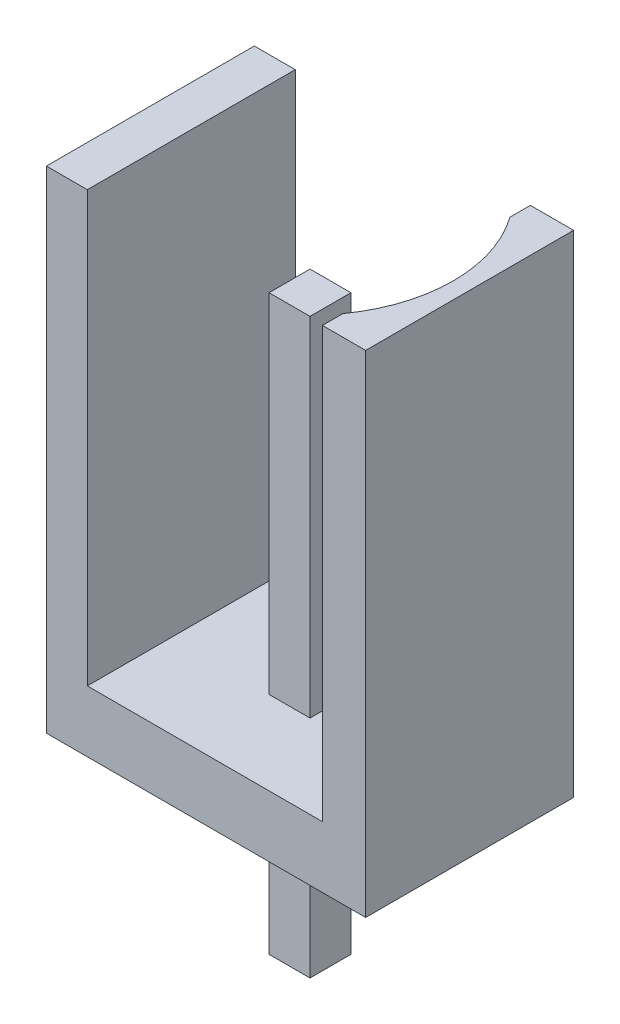
ISO-10303-21;
HEADER;
FILE_DESCRIPTION(('STEP AP214'),'2;1');
FILE_NAME('part.step','',(''),(''),'','','');
FILE_SCHEMA(('AUTOMOTIVE_DESIGN { 1 0 10303 214 1 1 1 1 }'));
ENDSEC;
DATA;
#1=APPLICATION_CONTEXT('core data for automotive mechanical design processes');
#2=APPLICATION_PROTOCOL_DEFINITION('international standard','automotive_design',2000,#1);
#3=PRODUCT_CONTEXT('',#1,'mechanical');
#4=PRODUCT('Part','Part','',(#3));
#5=PRODUCT_RELATED_PRODUCT_CATEGORY('part','',(#4));
#6=PRODUCT_DEFINITION_FORMATION('','',#4);
#7=PRODUCT_DEFINITION_CONTEXT('part definition',#1,'design');
#8=PRODUCT_DEFINITION('design','',#6,#7);
#9=PRODUCT_DEFINITION_SHAPE('','',#8);
#10=(LENGTH_UNIT() NAMED_UNIT(*) SI_UNIT(.MILLI.,.METRE.));
#11=(NAMED_UNIT(*) PLANE_ANGLE_UNIT() SI_UNIT($,.RADIAN.));
#12=(NAMED_UNIT(*) SI_UNIT($,.STERADIAN.) SOLID_ANGLE_UNIT());
#13=UNCERTAINTY_MEASURE_WITH_UNIT(LENGTH_MEASURE(1.E-05),#10,'distance_accuracy_value','');
#14=(GEOMETRIC_REPRESENTATION_CONTEXT(3) GLOBAL_UNCERTAINTY_ASSIGNED_CONTEXT((#13)) GLOBAL_UNIT_ASSIGNED_CONTEXT((#10,
#11,#12)) REPRESENTATION_CONTEXT('',''));
#15=CARTESIAN_POINT('',(0.,0.,0.));
#16=DIRECTION('',(0.,0.,1.));
#17=DIRECTION('',(1.,0.,0.));
#18=AXIS2_PLACEMENT_3D('',#15,#16,#17);
#19=CARTESIAN_POINT('',(-3.9,12.,-2.54));
#20=DIRECTION('',(0.,1.,0.));
#21=DIRECTION('',(0.,0.,1.));
#22=AXIS2_PLACEMENT_3D('',#19,#20,#21);
#23=PLANE('',#22);
#24=DIRECTION('',(0.,0.,1.));
#25=VECTOR('',#24,1.);
#26=CARTESIAN_POINT('',(-2.9,12.,2.54));
#27=LINE('',#26,#25);
#28=CARTESIAN_POINT('',(-2.9,12.,-2.54));
#29=VERTEX_POINT('',#28);
#30=CARTESIAN_POINT('',(-2.9,12.,2.54));
#31=VERTEX_POINT('',#30);
#32=EDGE_CURVE('E235',#29,#31,#27,.T.);
#33=ORIENTED_EDGE('',*,*,#32,.F.);
#34=DIRECTION('',(-1.,0.,0.));
#35=VECTOR('',#34,1.);
#36=CARTESIAN_POINT('',(-3.9,12.,-2.54));
#37=LINE('',#36,#35);
#38=CARTESIAN_POINT('',(-3.9,12.,-2.54));
#39=VERTEX_POINT('',#38);
#40=EDGE_CURVE('E266',#29,#39,#37,.T.);
#41=ORIENTED_EDGE('',*,*,#40,.T.);
#42=DIRECTION('',(0.,0.,1.));
#43=VECTOR('',#42,1.);
#44=CARTESIAN_POINT('',(-3.9,12.,-2.54));
#45=LINE('',#44,#43);
#46=CARTESIAN_POINT('',(-3.9,12.,2.54));
#47=VERTEX_POINT('',#46);
#48=EDGE_CURVE('E256',#39,#47,#45,.T.);
#49=ORIENTED_EDGE('',*,*,#48,.T.);
#50=DIRECTION('',(1.,0.,0.));
#51=VECTOR('',#50,1.);
#52=CARTESIAN_POINT('',(-3.9,12.,2.54));
#53=LINE('',#52,#51);
#54=EDGE_CURVE('E261',#47,#31,#53,.T.);
#55=ORIENTED_EDGE('',*,*,#54,.T.);
#56=EDGE_LOOP('',(#33,#41,#49,#55));
#57=FACE_BOUND('',#56,.T.);
#58=ADVANCED_FACE('F35',(#57),#23,.T.);
#59=CARTESIAN_POINT('',(-3.9,12.,-2.54));
#60=DIRECTION('',(1.,0.,0.));
#61=DIRECTION('',(0.,0.,-1.));
#62=AXIS2_PLACEMENT_3D('',#59,#60,#61);
#63=PLANE('',#62);
#64=DIRECTION('',(0.,0.,1.));
#65=VECTOR('',#64,1.);
#66=CARTESIAN_POINT('',(-3.9,0.,-2.54));
#67=LINE('',#66,#65);
#68=CARTESIAN_POINT('',(-3.9,0.,-2.54));
#69=VERTEX_POINT('',#68);
#70=CARTESIAN_POINT('',(-3.9,0.,2.54));
#71=VERTEX_POINT('',#70);
#72=EDGE_CURVE('E255',#69,#71,#67,.T.);
#73=ORIENTED_EDGE('',*,*,#72,.T.);
#74=DIRECTION('',(0.,-1.,0.));
#75=VECTOR('',#74,1.);
#76=CARTESIAN_POINT('',(-3.9,12.,2.54));
#77=LINE('',#76,#75);
#78=EDGE_CURVE('E286',#47,#71,#77,.T.);
#79=ORIENTED_EDGE('',*,*,#78,.F.);
#80=ORIENTED_EDGE('',*,*,#48,.F.);
#81=DIRECTION('',(0.,-1.,0.));
#82=VECTOR('',#81,1.);
#83=CARTESIAN_POINT('',(-3.9,12.,-2.54));
#84=LINE('',#83,#82);
#85=EDGE_CURVE('E270',#39,#69,#84,.T.);
#86=ORIENTED_EDGE('',*,*,#85,.T.);
#87=EDGE_LOOP('',(#73,#79,#80,#86));
#88=FACE_BOUND('',#87,.T.);
#89=ADVANCED_FACE('F37',(#88),#63,.F.);
#90=CARTESIAN_POINT('',(-3.9,12.,2.54));
#91=DIRECTION('',(0.,0.,-1.));
#92=DIRECTION('',(-1.,0.,0.));
#93=AXIS2_PLACEMENT_3D('',#90,#91,#92);
#94=PLANE('',#93);
#95=CARTESIAN_POINT('',(2.84401125173583,12.,2.54));
#96=VERTEX_POINT('',#95);
#97=CARTESIAN_POINT('',(3.9,12.,2.54));
#98=VERTEX_POINT('',#97);
#99=EDGE_CURVE('E259',#96,#98,#53,.T.);
#100=ORIENTED_EDGE('',*,*,#99,.F.);
#101=DIRECTION('',(0.,1.,0.));
#102=VECTOR('',#101,1.);
#103=CARTESIAN_POINT('',(2.84401125173583,-8.17107092124404,2.54));
#104=LINE('',#103,#102);
#105=CARTESIAN_POINT('',(2.84401125173583,1.5,2.54));
#106=VERTEX_POINT('',#105);
#107=EDGE_CURVE('E242',#106,#96,#104,.T.);
#108=ORIENTED_EDGE('',*,*,#107,.F.);
#109=DIRECTION('',(-1.,0.,0.));
#110=VECTOR('',#109,1.);
#111=CARTESIAN_POINT('',(2.84401125173583,1.5,2.54));
#112=LINE('',#111,#110);
#113=CARTESIAN_POINT('',(-2.9,1.5,2.54));
#114=VERTEX_POINT('',#113);
#115=EDGE_CURVE('E224',#106,#114,#112,.T.);
#116=ORIENTED_EDGE('',*,*,#115,.T.);
#117=DIRECTION('',(0.,1.,0.));
#118=VECTOR('',#117,1.);
#119=CARTESIAN_POINT('',(-2.9,-8.17107092124404,2.54));
#120=LINE('',#119,#118);
#121=EDGE_CURVE('E244',#114,#31,#120,.T.);
#122=ORIENTED_EDGE('',*,*,#121,.T.);
#123=ORIENTED_EDGE('',*,*,#54,.F.);
#124=ORIENTED_EDGE('',*,*,#78,.T.);
#125=DIRECTION('',(1.,0.,0.));
#126=VECTOR('',#125,1.);
#127=CARTESIAN_POINT('',(-3.9,0.,2.54));
#128=LINE('',#127,#126);
#129=CARTESIAN_POINT('',(3.9,0.,2.54));
#130=VERTEX_POINT('',#129);
#131=EDGE_CURVE('E273',#71,#130,#128,.T.);
#132=ORIENTED_EDGE('',*,*,#131,.T.);
#133=DIRECTION('',(0.,-1.,0.));
#134=VECTOR('',#133,1.);
#135=CARTESIAN_POINT('',(3.9,12.,2.54));
#136=LINE('',#135,#134);
#137=EDGE_CURVE('E283',#98,#130,#136,.T.);
#138=ORIENTED_EDGE('',*,*,#137,.F.);
#139=EDGE_LOOP('',(#100,#108,#116,#122,#123,#124,#132,#138));
#140=FACE_BOUND('',#139,.T.);
#141=ADVANCED_FACE('F328',(#140),#94,.F.);
#142=CARTESIAN_POINT('',(3.9,12.,-2.54));
#143=DIRECTION('',(-1.,0.,0.));
#144=DIRECTION('',(0.,0.,1.));
#145=AXIS2_PLACEMENT_3D('',#142,#143,#144);
#146=PLANE('',#145);
#147=DIRECTION('',(0.,0.,-1.));
#148=VECTOR('',#147,1.);
#149=CARTESIAN_POINT('',(3.9,0.,-2.54));
#150=LINE('',#149,#148);
#151=CARTESIAN_POINT('',(3.9,0.,-2.54));
#152=VERTEX_POINT('',#151);
#153=EDGE_CURVE('E275',#130,#152,#150,.T.);
#154=ORIENTED_EDGE('',*,*,#153,.T.);
#155=DIRECTION('',(0.,-1.,0.));
#156=VECTOR('',#155,1.);
#157=CARTESIAN_POINT('',(3.9,12.,-2.54));
#158=LINE('',#157,#156);
#159=CARTESIAN_POINT('',(3.9,12.,-2.54));
#160=VERTEX_POINT('',#159);
#161=EDGE_CURVE('E280',#160,#152,#158,.T.);
#162=ORIENTED_EDGE('',*,*,#161,.F.);
#163=DIRECTION('',(0.,0.,-1.));
#164=VECTOR('',#163,1.);
#165=CARTESIAN_POINT('',(3.9,12.,-2.54));
#166=LINE('',#165,#164);
#167=EDGE_CURVE('E264',#98,#160,#166,.T.);
#168=ORIENTED_EDGE('',*,*,#167,.F.);
#169=ORIENTED_EDGE('',*,*,#137,.T.);
#170=EDGE_LOOP('',(#154,#162,#168,#169));
#171=FACE_BOUND('',#170,.T.);
#172=ADVANCED_FACE('F343',(#171),#146,.F.);
#173=CARTESIAN_POINT('',(-3.9,12.,-2.54));
#174=DIRECTION('',(0.,0.,1.));
#175=DIRECTION('',(1.,0.,0.));
#176=AXIS2_PLACEMENT_3D('',#173,#174,#175);
#177=PLANE('',#176);
#178=ORIENTED_EDGE('',*,*,#40,.F.);
#179=DIRECTION('',(0.,1.,0.));
#180=VECTOR('',#179,1.);
#181=CARTESIAN_POINT('',(-2.9,-8.17107092124404,-2.54));
#182=LINE('',#181,#180);
#183=CARTESIAN_POINT('',(-2.9,1.5,-2.54));
#184=VERTEX_POINT('',#183);
#185=EDGE_CURVE('E247',#184,#29,#182,.T.);
#186=ORIENTED_EDGE('',*,*,#185,.F.);
#187=DIRECTION('',(1.,0.,0.));
#188=VECTOR('',#187,1.);
#189=CARTESIAN_POINT('',(2.84401125173583,1.5,-2.54));
#190=LINE('',#189,#188);
#191=CARTESIAN_POINT('',(2.84401125173583,1.5,-2.54));
#192=VERTEX_POINT('',#191);
#193=EDGE_CURVE('E218',#184,#192,#190,.T.);
#194=ORIENTED_EDGE('',*,*,#193,.T.);
#195=DIRECTION('',(0.,1.,0.));
#196=VECTOR('',#195,1.);
#197=CARTESIAN_POINT('',(2.84401125173583,-8.17107092124404,-2.54));
#198=LINE('',#197,#196);
#199=CARTESIAN_POINT('',(2.84401125173583,12.,-2.54));
#200=VERTEX_POINT('',#199);
#201=EDGE_CURVE('E249',#192,#200,#198,.T.);
#202=ORIENTED_EDGE('',*,*,#201,.T.);
#203=EDGE_CURVE('E267',#160,#200,#37,.T.);
#204=ORIENTED_EDGE('',*,*,#203,.F.);
#205=ORIENTED_EDGE('',*,*,#161,.T.);
#206=DIRECTION('',(-1.,0.,0.));
#207=VECTOR('',#206,1.);
#208=CARTESIAN_POINT('',(-3.9,0.,-2.54));
#209=LINE('',#208,#207);
#210=EDGE_CURVE('E260',#152,#69,#209,.T.);
#211=ORIENTED_EDGE('',*,*,#210,.T.);
#212=ORIENTED_EDGE('',*,*,#85,.F.);
#213=EDGE_LOOP('',(#178,#186,#194,#202,#204,#205,#211,#212));
#214=FACE_BOUND('',#213,.T.);
#215=ADVANCED_FACE('F335',(#214),#177,.F.);
#216=DIRECTION('',(0.,0.,-1.));
#217=VECTOR('',#216,1.);
#218=CARTESIAN_POINT('',(2.84401125173583,12.,2.04));
#219=LINE('',#218,#217);
#220=CARTESIAN_POINT('',(2.84401125173583,12.,2.04));
#221=VERTEX_POINT('',#220);
#222=EDGE_CURVE('E237',#96,#221,#219,.T.);
#223=ORIENTED_EDGE('',*,*,#222,.F.);
#224=ORIENTED_EDGE('',*,*,#99,.T.);
#225=ORIENTED_EDGE('',*,*,#167,.T.);
#226=ORIENTED_EDGE('',*,*,#203,.T.);
#227=DIRECTION('',(0.,0.,-1.));
#228=VECTOR('',#227,1.);
#229=CARTESIAN_POINT('',(2.84401125173583,12.,-2.04));
#230=LINE('',#229,#228);
#231=CARTESIAN_POINT('',(2.84401125173583,12.,-2.04));
#232=VERTEX_POINT('',#231);
#233=EDGE_CURVE('E233',#232,#200,#230,.T.);
#234=ORIENTED_EDGE('',*,*,#233,.F.);
#235=CARTESIAN_POINT('',(0.,12.,0.));
#236=DIRECTION('',(0.,1.,0.));
#237=DIRECTION('',(0.,0.,1.));
#238=AXIS2_PLACEMENT_3D('',#235,#236,#237);
#239=CIRCLE('',#238,3.5);
#240=EDGE_CURVE('E217',#221,#232,#239,.T.);
#241=ORIENTED_EDGE('',*,*,#240,.F.);
#242=EDGE_LOOP('',(#223,#224,#225,#226,#234,#241));
#243=FACE_BOUND('',#242,.T.);
#244=ADVANCED_FACE('F324',(#243),#23,.T.);
#245=CARTESIAN_POINT('',(-3.9,0.,-2.54));
#246=DIRECTION('',(0.,1.,0.));
#247=DIRECTION('',(0.,0.,1.));
#248=AXIS2_PLACEMENT_3D('',#245,#246,#247);
#249=PLANE('',#248);
#250=DIRECTION('',(-1.,0.,0.));
#251=VECTOR('',#250,1.);
#252=CARTESIAN_POINT('',(-3.9,0.,-0.5));
#253=LINE('',#252,#251);
#254=CARTESIAN_POINT('',(0.5,0.,-0.5));
#255=VERTEX_POINT('',#254);
#256=CARTESIAN_POINT('',(-0.5,0.,-0.5));
#257=VERTEX_POINT('',#256);
#258=EDGE_CURVE('E199',#255,#257,#253,.T.);
#259=ORIENTED_EDGE('',*,*,#258,.T.);
#260=DIRECTION('',(0.,0.,1.));
#261=VECTOR('',#260,1.);
#262=CARTESIAN_POINT('',(-0.5,0.,-2.54));
#263=LINE('',#262,#261);
#264=CARTESIAN_POINT('',(-0.5,0.,0.5));
#265=VERTEX_POINT('',#264);
#266=EDGE_CURVE('E162',#257,#265,#263,.T.);
#267=ORIENTED_EDGE('',*,*,#266,.T.);
#268=DIRECTION('',(1.,0.,0.));
#269=VECTOR('',#268,1.);
#270=CARTESIAN_POINT('',(-3.9,0.,0.5));
#271=LINE('',#270,#269);
#272=CARTESIAN_POINT('',(0.5,0.,0.5));
#273=VERTEX_POINT('',#272);
#274=EDGE_CURVE('E213',#265,#273,#271,.T.);
#275=ORIENTED_EDGE('',*,*,#274,.T.);
#276=DIRECTION('',(0.,0.,-1.));
#277=VECTOR('',#276,1.);
#278=CARTESIAN_POINT('',(0.5,0.,-2.54));
#279=LINE('',#278,#277);
#280=EDGE_CURVE('E210',#273,#255,#279,.T.);
#281=ORIENTED_EDGE('',*,*,#280,.T.);
#282=EDGE_LOOP('',(#259,#267,#275,#281));
#283=FACE_BOUND('',#282,.T.);
#284=ORIENTED_EDGE('',*,*,#72,.F.);
#285=ORIENTED_EDGE('',*,*,#210,.F.);
#286=ORIENTED_EDGE('',*,*,#153,.F.);
#287=ORIENTED_EDGE('',*,*,#131,.F.);
#288=EDGE_LOOP('',(#284,#285,#286,#287));
#289=FACE_BOUND('',#288,.T.);
#290=ADVANCED_FACE('F334',(#283,#289),#249,.F.);
#291=CARTESIAN_POINT('',(0.,-8.17107092124404,0.));
#292=DIRECTION('',(0.,1.,0.));
#293=DIRECTION('',(0.,0.,1.));
#294=AXIS2_PLACEMENT_3D('',#291,#292,#293);
#295=CYLINDRICAL_SURFACE('',#294,3.5);
#296=CARTESIAN_POINT('',(0.,1.5,0.));
#297=DIRECTION('',(0.,1.,0.));
#298=DIRECTION('',(0.,0.,1.));
#299=AXIS2_PLACEMENT_3D('',#296,#297,#298);
#300=CIRCLE('',#299,3.5);
#301=CARTESIAN_POINT('',(2.84401125173583,1.5,-2.04));
#302=VERTEX_POINT('',#301);
#303=CARTESIAN_POINT('',(2.84401125173583,1.5,2.04));
#304=VERTEX_POINT('',#303);
#305=EDGE_CURVE('E229',#302,#304,#300,.F.);
#306=ORIENTED_EDGE('',*,*,#305,.T.);
#307=DIRECTION('',(0.,1.,0.));
#308=VECTOR('',#307,1.);
#309=CARTESIAN_POINT('',(2.84401125173583,-8.17107092124404,2.04));
#310=LINE('',#309,#308);
#311=EDGE_CURVE('E222',#304,#221,#310,.T.);
#312=ORIENTED_EDGE('',*,*,#311,.T.);
#313=ORIENTED_EDGE('',*,*,#240,.T.);
#314=DIRECTION('',(0.,1.,0.));
#315=VECTOR('',#314,1.);
#316=CARTESIAN_POINT('',(2.84401125173583,-8.17107092124404,-2.04));
#317=LINE('',#316,#315);
#318=EDGE_CURVE('E240',#302,#232,#317,.T.);
#319=ORIENTED_EDGE('',*,*,#318,.F.);
#320=EDGE_LOOP('',(#306,#312,#313,#319));
#321=FACE_BOUND('',#320,.T.);
#322=ADVANCED_FACE('F341',(#321),#295,.F.);
#323=CARTESIAN_POINT('',(2.84401125173583,-8.17107092124404,2.04));
#324=DIRECTION('',(1.,0.,0.));
#325=DIRECTION('',(0.,0.,-1.));
#326=AXIS2_PLACEMENT_3D('',#323,#324,#325);
#327=PLANE('',#326);
#328=DIRECTION('',(0.,0.,1.));
#329=VECTOR('',#328,1.);
#330=CARTESIAN_POINT('',(2.84401125173583,1.5,2.04));
#331=LINE('',#330,#329);
#332=EDGE_CURVE('E227',#304,#106,#331,.T.);
#333=ORIENTED_EDGE('',*,*,#332,.T.);
#334=ORIENTED_EDGE('',*,*,#107,.T.);
#335=ORIENTED_EDGE('',*,*,#222,.T.);
#336=ORIENTED_EDGE('',*,*,#311,.F.);
#337=EDGE_LOOP('',(#333,#334,#335,#336));
#338=FACE_BOUND('',#337,.T.);
#339=ADVANCED_FACE('F372',(#338),#327,.F.);
#340=CARTESIAN_POINT('',(-2.9,-8.17107092124404,2.54));
#341=DIRECTION('',(-1.,0.,0.));
#342=DIRECTION('',(0.,0.,1.));
#343=AXIS2_PLACEMENT_3D('',#340,#341,#342);
#344=PLANE('',#343);
#345=DIRECTION('',(0.,0.,-1.));
#346=VECTOR('',#345,1.);
#347=CARTESIAN_POINT('',(-2.9,1.5,2.54));
#348=LINE('',#347,#346);
#349=EDGE_CURVE('E221',#114,#184,#348,.T.);
#350=ORIENTED_EDGE('',*,*,#349,.T.);
#351=ORIENTED_EDGE('',*,*,#185,.T.);
#352=ORIENTED_EDGE('',*,*,#32,.T.);
#353=ORIENTED_EDGE('',*,*,#121,.F.);
#354=EDGE_LOOP('',(#350,#351,#352,#353));
#355=FACE_BOUND('',#354,.T.);
#356=ADVANCED_FACE('F380',(#355),#344,.F.);
#357=CARTESIAN_POINT('',(2.84401125173583,-8.17107092124404,-2.04));
#358=DIRECTION('',(1.,0.,0.));
#359=DIRECTION('',(0.,0.,-1.));
#360=AXIS2_PLACEMENT_3D('',#357,#358,#359);
#361=PLANE('',#360);
#362=DIRECTION('',(0.,0.,1.));
#363=VECTOR('',#362,1.);
#364=CARTESIAN_POINT('',(2.84401125173583,1.5,-2.04));
#365=LINE('',#364,#363);
#366=EDGE_CURVE('E231',#192,#302,#365,.T.);
#367=ORIENTED_EDGE('',*,*,#366,.T.);
#368=ORIENTED_EDGE('',*,*,#318,.T.);
#369=ORIENTED_EDGE('',*,*,#233,.T.);
#370=ORIENTED_EDGE('',*,*,#201,.F.);
#371=EDGE_LOOP('',(#367,#368,#369,#370));
#372=FACE_BOUND('',#371,.T.);
#373=ADVANCED_FACE('F366',(#372),#361,.F.);
#374=CARTESIAN_POINT('',(-3.9,1.5,-2.54));
#375=DIRECTION('',(0.,1.,0.));
#376=DIRECTION('',(0.,0.,1.));
#377=AXIS2_PLACEMENT_3D('',#374,#375,#376);
#378=PLANE('',#377);
#379=DIRECTION('',(0.,0.,1.));
#380=VECTOR('',#379,1.);
#381=CARTESIAN_POINT('',(-0.5,1.5,-2.54));
#382=LINE('',#381,#380);
#383=CARTESIAN_POINT('',(-0.5,1.5,-0.5));
#384=VERTEX_POINT('',#383);
#385=CARTESIAN_POINT('',(-0.5,1.5,0.5));
#386=VERTEX_POINT('',#385);
#387=EDGE_CURVE('E12',#384,#386,#382,.T.);
#388=ORIENTED_EDGE('',*,*,#387,.F.);
#389=DIRECTION('',(-1.,0.,0.));
#390=VECTOR('',#389,1.);
#391=CARTESIAN_POINT('',(-3.9,1.5,-0.5));
#392=LINE('',#391,#390);
#393=CARTESIAN_POINT('',(0.5,1.5,-0.5));
#394=VERTEX_POINT('',#393);
#395=EDGE_CURVE('E289',#394,#384,#392,.T.);
#396=ORIENTED_EDGE('',*,*,#395,.F.);
#397=DIRECTION('',(0.,0.,-1.));
#398=VECTOR('',#397,1.);
#399=CARTESIAN_POINT('',(0.5,1.5,-2.54));
#400=LINE('',#399,#398);
#401=CARTESIAN_POINT('',(0.5,1.5,0.5));
#402=VERTEX_POINT('',#401);
#403=EDGE_CURVE('E292',#402,#394,#400,.T.);
#404=ORIENTED_EDGE('',*,*,#403,.F.);
#405=DIRECTION('',(1.,0.,0.));
#406=VECTOR('',#405,1.);
#407=CARTESIAN_POINT('',(-3.9,1.5,0.5));
#408=LINE('',#407,#406);
#409=EDGE_CURVE('E43',#386,#402,#408,.T.);
#410=ORIENTED_EDGE('',*,*,#409,.F.);
#411=EDGE_LOOP('',(#388,#396,#404,#410));
#412=FACE_BOUND('',#411,.T.);
#413=ORIENTED_EDGE('',*,*,#305,.F.);
#414=ORIENTED_EDGE('',*,*,#366,.F.);
#415=ORIENTED_EDGE('',*,*,#193,.F.);
#416=ORIENTED_EDGE('',*,*,#349,.F.);
#417=ORIENTED_EDGE('',*,*,#115,.F.);
#418=ORIENTED_EDGE('',*,*,#332,.F.);
#419=EDGE_LOOP('',(#413,#414,#415,#416,#417,#418));
#420=FACE_BOUND('',#419,.T.);
#421=ADVANCED_FACE('F306',(#412,#420),#378,.T.);
#422=CARTESIAN_POINT('',(0.,10.,0.));
#423=DIRECTION('',(0.,-1.,0.));
#424=DIRECTION('',(0.,0.,-1.));
#425=AXIS2_PLACEMENT_3D('',#422,#423,#424);
#426=PLANE('',#425);
#427=DIRECTION('',(0.,0.,-1.));
#428=VECTOR('',#427,1.);
#429=CARTESIAN_POINT('',(-0.5,10.,0.5));
#430=LINE('',#429,#428);
#431=CARTESIAN_POINT('',(-0.5,10.,0.5));
#432=VERTEX_POINT('',#431);
#433=CARTESIAN_POINT('',(-0.5,10.,-0.5));
#434=VERTEX_POINT('',#433);
#435=EDGE_CURVE('E185',#432,#434,#430,.T.);
#436=ORIENTED_EDGE('',*,*,#435,.F.);
#437=DIRECTION('',(-1.,0.,0.));
#438=VECTOR('',#437,1.);
#439=CARTESIAN_POINT('',(-0.5,10.,0.5));
#440=LINE('',#439,#438);
#441=CARTESIAN_POINT('',(0.5,10.,0.5));
#442=VERTEX_POINT('',#441);
#443=EDGE_CURVE('E165',#442,#432,#440,.T.);
#444=ORIENTED_EDGE('',*,*,#443,.F.);
#445=DIRECTION('',(0.,0.,1.));
#446=VECTOR('',#445,1.);
#447=CARTESIAN_POINT('',(0.5,10.,0.5));
#448=LINE('',#447,#446);
#449=CARTESIAN_POINT('',(0.5,10.,-0.5));
#450=VERTEX_POINT('',#449);
#451=EDGE_CURVE('E191',#450,#442,#448,.T.);
#452=ORIENTED_EDGE('',*,*,#451,.F.);
#453=DIRECTION('',(1.,0.,0.));
#454=VECTOR('',#453,1.);
#455=CARTESIAN_POINT('',(-0.5,10.,-0.5));
#456=LINE('',#455,#454);
#457=EDGE_CURVE('E188',#434,#450,#456,.T.);
#458=ORIENTED_EDGE('',*,*,#457,.F.);
#459=EDGE_LOOP('',(#436,#444,#452,#458));
#460=FACE_BOUND('',#459,.T.);
#461=ADVANCED_FACE('F303',(#460),#426,.F.);
#462=CARTESIAN_POINT('',(-0.5,10.,-0.5));
#463=DIRECTION('',(0.,0.,-1.));
#464=DIRECTION('',(-1.,0.,0.));
#465=AXIS2_PLACEMENT_3D('',#462,#463,#464);
#466=PLANE('',#465);
#467=DIRECTION('',(0.,-1.,0.));
#468=VECTOR('',#467,1.);
#469=CARTESIAN_POINT('',(0.5,10.,-0.5));
#470=LINE('',#469,#468);
#471=EDGE_CURVE('E205',#450,#394,#470,.T.);
#472=ORIENTED_EDGE('',*,*,#471,.T.);
#473=ORIENTED_EDGE('',*,*,#395,.T.);
#474=DIRECTION('',(0.,-1.,0.));
#475=VECTOR('',#474,1.);
#476=CARTESIAN_POINT('',(-0.5,10.,-0.5));
#477=LINE('',#476,#475);
#478=EDGE_CURVE('E164',#434,#384,#477,.T.);
#479=ORIENTED_EDGE('',*,*,#478,.F.);
#480=ORIENTED_EDGE('',*,*,#457,.T.);
#481=EDGE_LOOP('',(#472,#473,#479,#480));
#482=FACE_BOUND('',#481,.T.);
#483=ADVANCED_FACE('F309',(#482),#466,.T.);
#484=CARTESIAN_POINT('',(0.5,10.,0.5));
#485=DIRECTION('',(1.,0.,0.));
#486=DIRECTION('',(0.,0.,-1.));
#487=AXIS2_PLACEMENT_3D('',#484,#485,#486);
#488=PLANE('',#487);
#489=DIRECTION('',(0.,-1.,0.));
#490=VECTOR('',#489,1.);
#491=CARTESIAN_POINT('',(0.5,10.,0.5));
#492=LINE('',#491,#490);
#493=EDGE_CURVE('E201',#442,#402,#492,.T.);
#494=ORIENTED_EDGE('',*,*,#493,.T.);
#495=ORIENTED_EDGE('',*,*,#403,.T.);
#496=ORIENTED_EDGE('',*,*,#471,.F.);
#497=ORIENTED_EDGE('',*,*,#451,.T.);
#498=EDGE_LOOP('',(#494,#495,#496,#497));
#499=FACE_BOUND('',#498,.T.);
#500=ADVANCED_FACE('F297',(#499),#488,.T.);
#501=CARTESIAN_POINT('',(-0.5,10.,0.5));
#502=DIRECTION('',(0.,0.,1.));
#503=DIRECTION('',(1.,0.,0.));
#504=AXIS2_PLACEMENT_3D('',#501,#502,#503);
#505=PLANE('',#504);
#506=DIRECTION('',(0.,-1.,0.));
#507=VECTOR('',#506,1.);
#508=CARTESIAN_POINT('',(-0.5,10.,0.5));
#509=LINE('',#508,#507);
#510=EDGE_CURVE('E196',#432,#386,#509,.T.);
#511=ORIENTED_EDGE('',*,*,#510,.T.);
#512=ORIENTED_EDGE('',*,*,#409,.T.);
#513=ORIENTED_EDGE('',*,*,#493,.F.);
#514=ORIENTED_EDGE('',*,*,#443,.T.);
#515=EDGE_LOOP('',(#511,#512,#513,#514));
#516=FACE_BOUND('',#515,.T.);
#517=ADVANCED_FACE('F295',(#516),#505,.T.);
#518=CARTESIAN_POINT('',(-0.5,10.,0.5));
#519=DIRECTION('',(-1.,0.,0.));
#520=DIRECTION('',(0.,0.,1.));
#521=AXIS2_PLACEMENT_3D('',#518,#519,#520);
#522=PLANE('',#521);
#523=ORIENTED_EDGE('',*,*,#478,.T.);
#524=ORIENTED_EDGE('',*,*,#387,.T.);
#525=ORIENTED_EDGE('',*,*,#510,.F.);
#526=ORIENTED_EDGE('',*,*,#435,.T.);
#527=EDGE_LOOP('',(#523,#524,#525,#526));
#528=FACE_BOUND('',#527,.T.);
#529=ADVANCED_FACE('F305',(#528),#522,.T.);
#530=ORIENTED_EDGE('',*,*,#266,.F.);
#531=CARTESIAN_POINT('',(-0.5,-4.,-0.5));
#532=VERTEX_POINT('',#531);
#533=EDGE_CURVE('E50',#257,#532,#477,.T.);
#534=ORIENTED_EDGE('',*,*,#533,.T.);
#535=DIRECTION('',(0.,0.,-1.));
#536=VECTOR('',#535,1.);
#537=CARTESIAN_POINT('',(-0.5,-4.,0.5));
#538=LINE('',#537,#536);
#539=CARTESIAN_POINT('',(-0.5,-4.,0.5));
#540=VERTEX_POINT('',#539);
#541=EDGE_CURVE('E160',#540,#532,#538,.T.);
#542=ORIENTED_EDGE('',*,*,#541,.F.);
#543=EDGE_CURVE('E200',#265,#540,#509,.T.);
#544=ORIENTED_EDGE('',*,*,#543,.F.);
#545=EDGE_LOOP('',(#530,#534,#542,#544));
#546=FACE_BOUND('',#545,.T.);
#547=ADVANCED_FACE('F157',(#546),#522,.T.);
#548=ORIENTED_EDGE('',*,*,#274,.F.);
#549=ORIENTED_EDGE('',*,*,#543,.T.);
#550=DIRECTION('',(-1.,0.,0.));
#551=VECTOR('',#550,1.);
#552=CARTESIAN_POINT('',(-0.5,-4.,0.5));
#553=LINE('',#552,#551);
#554=CARTESIAN_POINT('',(0.5,-4.,0.5));
#555=VERTEX_POINT('',#554);
#556=EDGE_CURVE('E180',#555,#540,#553,.T.);
#557=ORIENTED_EDGE('',*,*,#556,.F.);
#558=EDGE_CURVE('E204',#273,#555,#492,.T.);
#559=ORIENTED_EDGE('',*,*,#558,.F.);
#560=EDGE_LOOP('',(#548,#549,#557,#559));
#561=FACE_BOUND('',#560,.T.);
#562=ADVANCED_FACE('F448',(#561),#505,.T.);
#563=ORIENTED_EDGE('',*,*,#280,.F.);
#564=ORIENTED_EDGE('',*,*,#558,.T.);
#565=DIRECTION('',(0.,0.,1.));
#566=VECTOR('',#565,1.);
#567=CARTESIAN_POINT('',(0.5,-4.,0.5));
#568=LINE('',#567,#566);
#569=CARTESIAN_POINT('',(0.5,-4.,-0.5));
#570=VERTEX_POINT('',#569);
#571=EDGE_CURVE('E175',#570,#555,#568,.T.);
#572=ORIENTED_EDGE('',*,*,#571,.F.);
#573=EDGE_CURVE('E171',#255,#570,#470,.T.);
#574=ORIENTED_EDGE('',*,*,#573,.F.);
#575=EDGE_LOOP('',(#563,#564,#572,#574));
#576=FACE_BOUND('',#575,.T.);
#577=ADVANCED_FACE('F317',(#576),#488,.T.);
#578=ORIENTED_EDGE('',*,*,#258,.F.);
#579=ORIENTED_EDGE('',*,*,#573,.T.);
#580=DIRECTION('',(1.,0.,0.));
#581=VECTOR('',#580,1.);
#582=CARTESIAN_POINT('',(-0.5,-4.,-0.5));
#583=LINE('',#582,#581);
#584=EDGE_CURVE('E168',#532,#570,#583,.T.);
#585=ORIENTED_EDGE('',*,*,#584,.F.);
#586=ORIENTED_EDGE('',*,*,#533,.F.);
#587=EDGE_LOOP('',(#578,#579,#585,#586));
#588=FACE_BOUND('',#587,.T.);
#589=ADVANCED_FACE('F169',(#588),#466,.T.);
#590=CARTESIAN_POINT('',(0.,-4.,0.));
#591=DIRECTION('',(0.,-1.,0.));
#592=DIRECTION('',(0.,0.,-1.));
#593=AXIS2_PLACEMENT_3D('',#590,#591,#592);
#594=PLANE('',#593);
#595=ORIENTED_EDGE('',*,*,#541,.T.);
#596=ORIENTED_EDGE('',*,*,#584,.T.);
#597=ORIENTED_EDGE('',*,*,#571,.T.);
#598=ORIENTED_EDGE('',*,*,#556,.T.);
#599=EDGE_LOOP('',(#595,#596,#597,#598));
#600=FACE_BOUND('',#599,.T.);
#601=ADVANCED_FACE('F178',(#600),#594,.T.);
#602=CLOSED_SHELL('',(#58,#89,#141,#172,#215,#244,#290,#322,#339,#356,#373,#421,#461,#483,#500,
#517,#529,#547,#562,#577,#589,#601));
#603=MANIFOLD_SOLID_BREP('B2',#602);
#604=ADVANCED_BREP_SHAPE_REPRESENTATION('',(#18,#603),#14);
#605=SHAPE_DEFINITION_REPRESENTATION(#9,#604);
ENDSEC;
END-ISO-10303-21;
